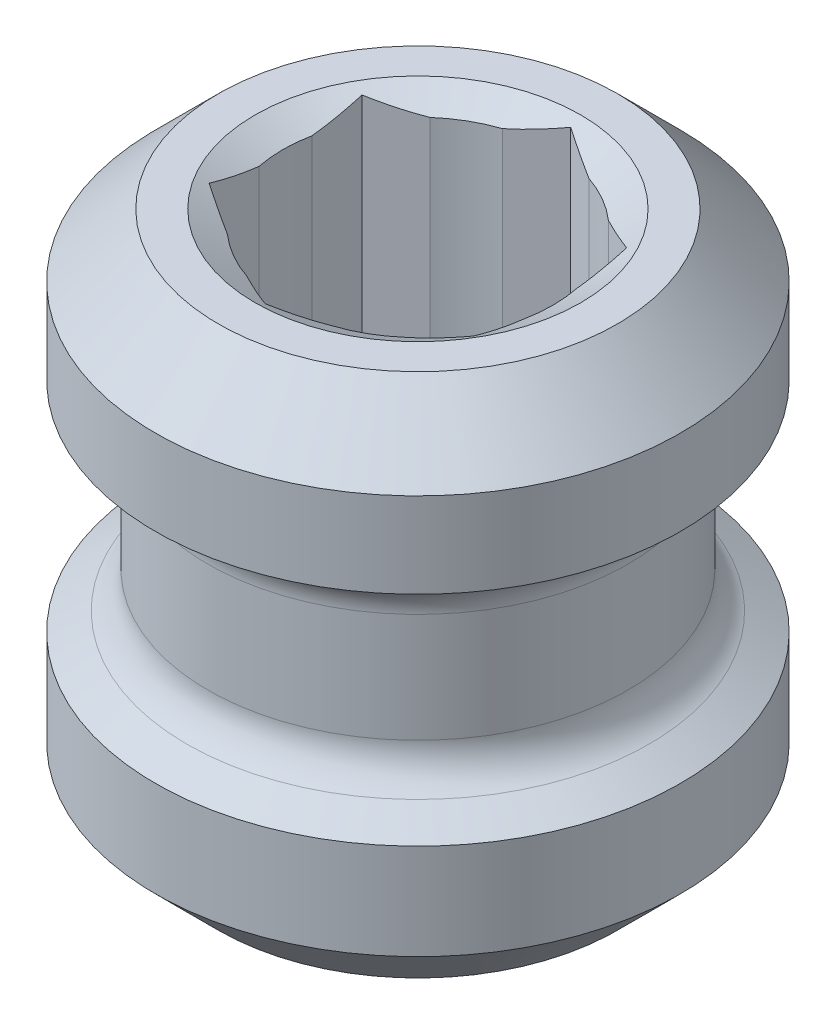
ISO-10303-21;
HEADER;
FILE_DESCRIPTION(('STEP AP214'),'2;1');
FILE_NAME('part.step','',(''),(''),'','','');
FILE_SCHEMA(('AUTOMOTIVE_DESIGN { 1 0 10303 214 1 1 1 1 }'));
ENDSEC;
DATA;
#1=APPLICATION_CONTEXT('core data for automotive mechanical design processes');
#2=APPLICATION_PROTOCOL_DEFINITION('international standard','automotive_design',2000,#1);
#3=PRODUCT_CONTEXT('',#1,'mechanical');
#4=PRODUCT('Part','Part','',(#3));
#5=PRODUCT_RELATED_PRODUCT_CATEGORY('part','',(#4));
#6=PRODUCT_DEFINITION_FORMATION('','',#4);
#7=PRODUCT_DEFINITION_CONTEXT('part definition',#1,'design');
#8=PRODUCT_DEFINITION('design','',#6,#7);
#9=PRODUCT_DEFINITION_SHAPE('','',#8);
#10=(LENGTH_UNIT() NAMED_UNIT(*) SI_UNIT(.MILLI.,.METRE.));
#11=(NAMED_UNIT(*) PLANE_ANGLE_UNIT() SI_UNIT($,.RADIAN.));
#12=(NAMED_UNIT(*) SI_UNIT($,.STERADIAN.) SOLID_ANGLE_UNIT());
#13=UNCERTAINTY_MEASURE_WITH_UNIT(LENGTH_MEASURE(1.E-05),#10,'distance_accuracy_value','');
#14=(GEOMETRIC_REPRESENTATION_CONTEXT(3) GLOBAL_UNCERTAINTY_ASSIGNED_CONTEXT((#13)) GLOBAL_UNIT_ASSIGNED_CONTEXT((#10,
#11,#12)) REPRESENTATION_CONTEXT('',''));
#15=CARTESIAN_POINT('',(0.,0.,0.));
#16=DIRECTION('',(0.,0.,1.));
#17=DIRECTION('',(1.,0.,0.));
#18=AXIS2_PLACEMENT_3D('',#15,#16,#17);
#19=CARTESIAN_POINT('',(-1.9,0.,1.9));
#20=DIRECTION('',(0.,1.,0.));
#21=DIRECTION('',(1.,0.,0.));
#22=AXIS2_PLACEMENT_3D('',#19,#20,#21);
#23=PLANE('',#22);
#24=CARTESIAN_POINT('',(0.,0.,0.));
#25=DIRECTION('',(0.,1.,0.));
#26=DIRECTION('',(0.,0.,-1.));
#27=AXIS2_PLACEMENT_3D('',#24,#25,#26);
#28=CIRCLE('',#27,1.9);
#29=CARTESIAN_POINT('',(0.,0.,-1.9));
#30=VERTEX_POINT('',#29);
#31=EDGE_CURVE('E687',#30,#30,#28,.F.);
#32=ORIENTED_EDGE('',*,*,#31,.F.);
#33=EDGE_LOOP('',(#32));
#34=FACE_BOUND('',#33,.T.);
#35=CARTESIAN_POINT('',(0.,0.,0.));
#36=DIRECTION('',(0.,-1.,0.));
#37=DIRECTION('',(-1.42053891230658E-07,0.,0.99999999999999));
#38=AXIS2_PLACEMENT_3D('',#35,#36,#37);
#39=CIRCLE('',#38,1.55);
#40=CARTESIAN_POINT('',(-2.2018353140752E-07,0.,1.54999999999998));
#41=VERTEX_POINT('',#40);
#42=EDGE_CURVE('E690',#41,#41,#39,.T.);
#43=ORIENTED_EDGE('',*,*,#42,.T.);
#44=EDGE_LOOP('',(#43));
#45=FACE_BOUND('',#44,.T.);
#46=ADVANCED_FACE('F17',(#34,#45),#23,.T.);
#47=CARTESIAN_POINT('',(-1.89999990775909,-5.,-1.9));
#48=DIRECTION('',(0.,-1.,0.));
#49=DIRECTION('',(1.,0.,0.));
#50=AXIS2_PLACEMENT_3D('',#47,#48,#49);
#51=PLANE('',#50);
#52=CARTESIAN_POINT('',(0.,-5.,0.));
#53=DIRECTION('',(0.,-1.,0.));
#54=DIRECTION('',(-1.42331230310484E-07,0.,0.99999999999999));
#55=AXIS2_PLACEMENT_3D('',#52,#53,#54);
#56=CIRCLE('',#55,1.9);
#57=CARTESIAN_POINT('',(-2.70429337589919E-07,-5.,1.89999999999998));
#58=VERTEX_POINT('',#57);
#59=EDGE_CURVE('E162',#58,#58,#56,.T.);
#60=ORIENTED_EDGE('',*,*,#59,.T.);
#61=EDGE_LOOP('',(#60));
#62=FACE_BOUND('',#61,.T.);
#63=ADVANCED_FACE('F677',(#62),#51,.T.);
#64=CARTESIAN_POINT('',(-0.411553782362925,-2.5,1.21731199132464));
#65=DIRECTION('',(0.,1.,0.));
#66=DIRECTION('',(0.,0.,1.));
#67=AXIS2_PLACEMENT_3D('',#64,#65,#66);
#68=PLANE('',#67);
#69=DIRECTION('',(0.866025403784427,0.,0.50000000000002));
#70=VECTOR('',#69,1.);
#71=CARTESIAN_POINT('',(-0.411553782362925,-2.5,1.21731199132464));
#72=LINE('',#71,#70);
#73=CARTESIAN_POINT('',(-0.411553782362925,-2.5,1.21731199132464));
#74=VERTEX_POINT('',#73);
#75=CARTESIAN_POINT('',(0.,-2.5,1.4549226783579));
#76=VERTEX_POINT('',#75);
#77=EDGE_CURVE('E147',#74,#76,#72,.T.);
#78=ORIENTED_EDGE('',*,*,#77,.T.);
#79=DIRECTION('',(0.866025403784427,0.,-0.500000000000021));
#80=VECTOR('',#79,1.);
#81=CARTESIAN_POINT('',(0.,-2.5,1.4549226783579));
#82=LINE('',#81,#80);
#83=CARTESIAN_POINT('',(0.411553782362922,-2.5,1.21731199132464));
#84=VERTEX_POINT('',#83);
#85=EDGE_CURVE('E160',#76,#84,#82,.T.);
#86=ORIENTED_EDGE('',*,*,#85,.T.);
#87=CARTESIAN_POINT('',(0.,-2.5,0.));
#88=DIRECTION('',(0.,-1.,0.));
#89=DIRECTION('',(0.,0.,1.));
#90=AXIS2_PLACEMENT_3D('',#87,#88,#89);
#91=CIRCLE('',#90,1.285);
#92=EDGE_CURVE('E161',#74,#84,#91,.F.);
#93=ORIENTED_EDGE('',*,*,#92,.F.);
#94=EDGE_LOOP('',(#78,#86,#93));
#95=FACE_BOUND('',#94,.T.);
#96=ADVANCED_FACE('F159',(#95),#68,.T.);
#97=CARTESIAN_POINT('',(-3.23030319388712E-10,-2.5,1.4549226785444));
#98=DIRECTION('',(-0.500000000000021,0.,-0.866025403784426));
#99=DIRECTION('',(0.,1.,0.));
#100=AXIS2_PLACEMENT_3D('',#97,#98,#99);
#101=PLANE('',#100);
#102=CARTESIAN_POINT('',(-7.15967421970864E-11,-0.0548929171704897,1.45492267839924));
#103=CARTESIAN_POINT('',(0.135696955066982,-0.100125235606626,1.37657800482176));
#104=CARTESIAN_POINT('',(0.27244949612285,-0.134794104457231,1.29762388843079));
#105=CARTESIAN_POINT('',(0.411553782307821,-0.152997821332945,1.21731199135646));
#106=B_SPLINE_CURVE_WITH_KNOTS('',3,(#102,#103,#104,#105),.UNSPECIFIED.,.F.,.F.,(4,4),(0.,1.),.UNSPECIFIED.);
#107=CARTESIAN_POINT('',(-7.15967421970863E-11,-0.0548929171704895,1.45492267839924));
#108=VERTEX_POINT('',#107);
#109=CARTESIAN_POINT('',(0.411553782307821,-0.152997821332945,1.21731199135646));
#110=VERTEX_POINT('',#109);
#111=EDGE_CURVE('E167',#108,#110,#106,.T.);
#112=ORIENTED_EDGE('',*,*,#111,.T.);
#113=DIRECTION('',(2.3477481819412E-11,-1.,-1.35547367491119E-11));
#114=VECTOR('',#113,1.);
#115=CARTESIAN_POINT('',(0.411553782307821,-0.152997821332945,1.21731199135646));
#116=LINE('',#115,#114);
#117=EDGE_CURVE('E154',#110,#84,#116,.T.);
#118=ORIENTED_EDGE('',*,*,#117,.T.);
#119=ORIENTED_EDGE('',*,*,#85,.F.);
#120=DIRECTION('',(-2.92816486784645E-11,1.,1.69057993725262E-11));
#121=VECTOR('',#120,1.);
#122=CARTESIAN_POINT('',(0.,-2.5,1.4549226783579));
#123=LINE('',#122,#121);
#124=EDGE_CURVE('E143',#76,#108,#123,.T.);
#125=ORIENTED_EDGE('',*,*,#124,.T.);
#126=EDGE_LOOP('',(#112,#118,#119,#125));
#127=FACE_BOUND('',#126,.T.);
#128=ADVANCED_FACE('F165',(#127),#101,.T.);
#129=CARTESIAN_POINT('',(-0.411553782363124,-2.5,1.21731199132453));
#130=DIRECTION('',(0.500000000000021,0.,-0.866025403784426));
#131=DIRECTION('',(0.,1.,0.));
#132=AXIS2_PLACEMENT_3D('',#129,#130,#131);
#133=PLANE('',#132);
#134=CARTESIAN_POINT('',(-0.41155378236312,-0.152997821336553,1.21731199132453));
#135=CARTESIAN_POINT('',(-0.272239159490032,-0.134766579907637,1.29774532634236));
#136=CARTESIAN_POINT('',(-0.135439762622364,-0.10003950473868,1.37672649494889));
#137=CARTESIAN_POINT('',(-4.40698367555614E-11,-0.0548929171704897,1.45492267833246));
#138=B_SPLINE_CURVE_WITH_KNOTS('',3,(#134,#135,#136,#137),.UNSPECIFIED.,.F.,.F.,(4,4),(0.,1.),.UNSPECIFIED.);
#139=CARTESIAN_POINT('',(-0.41155378236312,-0.152997821336553,1.21731199132453));
#140=VERTEX_POINT('',#139);
#141=EDGE_CURVE('E149',#140,#108,#138,.T.);
#142=ORIENTED_EDGE('',*,*,#141,.T.);
#143=ORIENTED_EDGE('',*,*,#124,.F.);
#144=ORIENTED_EDGE('',*,*,#77,.F.);
#145=DIRECTION('',(0.,1.,0.));
#146=VECTOR('',#145,1.);
#147=CARTESIAN_POINT('',(-0.411553782362925,-2.5,1.21731199132464));
#148=LINE('',#147,#146);
#149=EDGE_CURVE('E202',#74,#140,#148,.T.);
#150=ORIENTED_EDGE('',*,*,#149,.T.);
#151=EDGE_LOOP('',(#142,#143,#144,#150));
#152=FACE_BOUND('',#151,.T.);
#153=ADVANCED_FACE('F145',(#152),#133,.T.);
#154=CARTESIAN_POINT('',(-1.26,-2.5,0.252239965112585));
#155=DIRECTION('',(0.,1.,0.));
#156=DIRECTION('',(0.,0.,1.));
#157=AXIS2_PLACEMENT_3D('',#154,#155,#156);
#158=PLANE('',#157);
#159=DIRECTION('',(0.,0.,1.));
#160=VECTOR('',#159,1.);
#161=CARTESIAN_POINT('',(-1.26,-2.5,0.252239965112585));
#162=LINE('',#161,#160);
#163=CARTESIAN_POINT('',(-1.26,-2.5,0.252239965112585));
#164=VERTEX_POINT('',#163);
#165=CARTESIAN_POINT('',(-1.26,-2.5,0.72746133917893));
#166=VERTEX_POINT('',#165);
#167=EDGE_CURVE('E209',#164,#166,#162,.T.);
#168=ORIENTED_EDGE('',*,*,#167,.T.);
#169=DIRECTION('',(0.866025403784427,0.,0.500000000000021));
#170=VECTOR('',#169,1.);
#171=CARTESIAN_POINT('',(-1.26,-2.5,0.72746133917893));
#172=LINE('',#171,#170);
#173=CARTESIAN_POINT('',(-0.848446217637154,-2.5,0.965072026212141));
#174=VERTEX_POINT('',#173);
#175=EDGE_CURVE('E214',#166,#174,#172,.T.);
#176=ORIENTED_EDGE('',*,*,#175,.T.);
#177=CARTESIAN_POINT('',(0.,-2.5,0.));
#178=DIRECTION('',(0.,-1.,0.));
#179=DIRECTION('',(-0.660269430067824,0.,0.751028814172872));
#180=AXIS2_PLACEMENT_3D('',#177,#178,#179);
#181=CIRCLE('',#180,1.285);
#182=EDGE_CURVE('E219',#164,#174,#181,.F.);
#183=ORIENTED_EDGE('',*,*,#182,.F.);
#184=EDGE_LOOP('',(#168,#176,#183));
#185=FACE_BOUND('',#184,.T.);
#186=ADVANCED_FACE('F195',(#185),#158,.T.);
#187=CARTESIAN_POINT('',(-1.26000000018504,-2.5,0.727461339072096));
#188=DIRECTION('',(0.500000000000021,0.,-0.866025403784426));
#189=DIRECTION('',(0.,1.,0.));
#190=AXIS2_PLACEMENT_3D('',#187,#188,#189);
#191=PLANE('',#190);
#192=CARTESIAN_POINT('',(-1.26000000004688,-0.0548929172057787,0.727461339151866));
#193=CARTESIAN_POINT('',(-1.12430368448686,-0.100125199416145,0.805805643468487));
#194=CARTESIAN_POINT('',(-0.987551792711206,-0.134794132867628,0.884759384997355));
#195=CARTESIAN_POINT('',(-0.848448183927942,-0.152998100066561,0.965070890973625));
#196=B_SPLINE_CURVE_WITH_KNOTS('',3,(#192,#193,#194,#195),.UNSPECIFIED.,.F.,.F.,(4,4),(0.,1.),.UNSPECIFIED.);
#197=CARTESIAN_POINT('',(-1.26000000004688,-0.0548929172057786,0.727461339151866));
#198=VERTEX_POINT('',#197);
#199=CARTESIAN_POINT('',(-0.848448183927942,-0.152998100066561,0.965070890973625));
#200=VERTEX_POINT('',#199);
#201=EDGE_CURVE('E223',#198,#200,#196,.T.);
#202=ORIENTED_EDGE('',*,*,#201,.T.);
#203=DIRECTION('',(8.37788324103234E-07,-0.999999999999532,4.83697314434155E-07));
#204=VECTOR('',#203,1.);
#205=CARTESIAN_POINT('',(-0.848448183927942,-0.152998100066561,0.965070890973625));
#206=LINE('',#205,#204);
#207=EDGE_CURVE('E234',#200,#174,#206,.T.);
#208=ORIENTED_EDGE('',*,*,#207,.T.);
#209=ORIENTED_EDGE('',*,*,#175,.F.);
#210=DIRECTION('',(-1.9171463272424E-11,1.,-1.10686431216181E-11));
#211=VECTOR('',#210,1.);
#212=CARTESIAN_POINT('',(-1.26,-2.5,0.72746133917893));
#213=LINE('',#212,#211);
#214=EDGE_CURVE('E937',#166,#198,#213,.T.);
#215=ORIENTED_EDGE('',*,*,#214,.T.);
#216=EDGE_LOOP('',(#202,#208,#209,#215));
#217=FACE_BOUND('',#216,.T.);
#218=ADVANCED_FACE('F236',(#217),#191,.T.);
#219=CARTESIAN_POINT('',(-1.26,-2.5,0.252239965112361));
#220=DIRECTION('',(1.,0.,0.));
#221=DIRECTION('',(0.,1.,0.));
#222=AXIS2_PLACEMENT_3D('',#219,#220,#221);
#223=PLANE('',#222);
#224=CARTESIAN_POINT('',(-1.26,-0.152997821336549,0.252239965112361));
#225=CARTESIAN_POINT('',(-1.26,-0.134766583498668,0.413106603495697));
#226=CARTESIAN_POINT('',(-1.26,-0.100039515931176,0.571068933652496));
#227=CARTESIAN_POINT('',(-1.26,-0.0548929172057787,0.727461339141318));
#228=B_SPLINE_CURVE_WITH_KNOTS('',3,(#224,#225,#226,#227),.UNSPECIFIED.,.F.,.F.,(4,4),(0.,1.),.UNSPECIFIED.);
#229=CARTESIAN_POINT('',(-1.26,-0.15299782133655,0.252239965112361));
#230=VERTEX_POINT('',#229);
#231=EDGE_CURVE('E268',#230,#198,#228,.T.);
#232=ORIENTED_EDGE('',*,*,#231,.T.);
#233=ORIENTED_EDGE('',*,*,#214,.F.);
#234=ORIENTED_EDGE('',*,*,#167,.F.);
#235=DIRECTION('',(0.,1.,0.));
#236=VECTOR('',#235,1.);
#237=CARTESIAN_POINT('',(-1.26,-2.5,0.252239965112585));
#238=LINE('',#237,#236);
#239=EDGE_CURVE('E259',#164,#230,#238,.T.);
#240=ORIENTED_EDGE('',*,*,#239,.T.);
#241=EDGE_LOOP('',(#232,#233,#234,#240));
#242=FACE_BOUND('',#241,.T.);
#243=ADVANCED_FACE('F245',(#242),#223,.T.);
#244=CARTESIAN_POINT('',(-1.26,-2.5,-0.965072026212144));
#245=DIRECTION('',(0.,1.,0.));
#246=DIRECTION('',(0.,0.,1.));
#247=AXIS2_PLACEMENT_3D('',#244,#245,#246);
#248=PLANE('',#247);
#249=DIRECTION('',(-0.866025403784426,0.,0.500000000000022));
#250=VECTOR('',#249,1.);
#251=CARTESIAN_POINT('',(-0.84844621763715,-2.5,-0.965072026212144));
#252=LINE('',#251,#250);
#253=CARTESIAN_POINT('',(-0.84844621763715,-2.5,-0.965072026212144));
#254=VERTEX_POINT('',#253);
#255=CARTESIAN_POINT('',(-1.26,-2.5,-0.72746133917893));
#256=VERTEX_POINT('',#255);
#257=EDGE_CURVE('E267',#254,#256,#252,.T.);
#258=ORIENTED_EDGE('',*,*,#257,.T.);
#259=DIRECTION('',(0.,0.,1.));
#260=VECTOR('',#259,1.);
#261=CARTESIAN_POINT('',(-1.26,-2.5,-0.72746133917893));
#262=LINE('',#261,#260);
#263=CARTESIAN_POINT('',(-1.26,-2.5,-0.252239965112591));
#264=VERTEX_POINT('',#263);
#265=EDGE_CURVE('E273',#256,#264,#262,.T.);
#266=ORIENTED_EDGE('',*,*,#265,.T.);
#267=CARTESIAN_POINT('',(0.,-2.5,0.));
#268=DIRECTION('',(0.,-1.,0.));
#269=DIRECTION('',(-0.980544747081712,0.,-0.196295692694623));
#270=AXIS2_PLACEMENT_3D('',#267,#268,#269);
#271=CIRCLE('',#270,1.285);
#272=EDGE_CURVE('E278',#254,#264,#271,.F.);
#273=ORIENTED_EDGE('',*,*,#272,.F.);
#274=EDGE_LOOP('',(#258,#266,#273));
#275=FACE_BOUND('',#274,.T.);
#276=ADVANCED_FACE('F249',(#275),#248,.T.);
#277=CARTESIAN_POINT('',(-0.848446217636949,-2.5,-0.96507202621226));
#278=DIRECTION('',(0.500000000000021,0.,0.866025403784426));
#279=DIRECTION('',(0.,1.,0.));
#280=AXIS2_PLACEMENT_3D('',#277,#278,#279);
#281=PLANE('',#280);
#282=CARTESIAN_POINT('',(-0.848446217636953,-0.152997821336551,-0.965072026212258));
#283=CARTESIAN_POINT('',(-0.987756949960992,-0.134765650157228,-0.884640937403965));
#284=CARTESIAN_POINT('',(-1.12455259645385,-0.100038588373231,-0.805661934077342));
#285=CARTESIAN_POINT('',(-1.25998865219525,-0.0548924381989111,-0.72746789083706));
#286=B_SPLINE_CURVE_WITH_KNOTS('',3,(#282,#283,#284,#285),.UNSPECIFIED.,.F.,.F.,(4,4),(0.,1.),.UNSPECIFIED.);
#287=CARTESIAN_POINT('',(-0.848446217636953,-0.152997821336551,-0.965072026212258));
#288=VERTEX_POINT('',#287);
#289=CARTESIAN_POINT('',(-1.25998865219525,-0.0548924381989111,-0.72746789083706));
#290=VERTEX_POINT('',#289);
#291=EDGE_CURVE('E282',#288,#290,#286,.T.);
#292=ORIENTED_EDGE('',*,*,#291,.T.);
#293=DIRECTION('',(-4.64102476775778E-06,-0.999999999985641,2.67949689900884E-06));
#294=VECTOR('',#293,1.);
#295=CARTESIAN_POINT('',(-1.25998865219525,-0.0548924381989111,-0.72746789083706));
#296=LINE('',#295,#294);
#297=EDGE_CURVE('E295',#256,#290,#296,.F.);
#298=ORIENTED_EDGE('',*,*,#297,.F.);
#299=ORIENTED_EDGE('',*,*,#257,.F.);
#300=DIRECTION('',(0.,1.,0.));
#301=VECTOR('',#300,1.);
#302=CARTESIAN_POINT('',(-0.84844621763715,-2.5,-0.965072026212144));
#303=LINE('',#302,#301);
#304=EDGE_CURVE('E924',#254,#288,#303,.T.);
#305=ORIENTED_EDGE('',*,*,#304,.T.);
#306=EDGE_LOOP('',(#292,#298,#299,#305));
#307=FACE_BOUND('',#306,.T.);
#308=ADVANCED_FACE('F297',(#307),#281,.T.);
#309=CARTESIAN_POINT('',(-1.26,-2.5,-0.727475272094648));
#310=DIRECTION('',(1.,0.,0.));
#311=DIRECTION('',(0.,1.,0.));
#312=AXIS2_PLACEMENT_3D('',#309,#310,#311);
#313=PLANE('',#312);
#314=CARTESIAN_POINT('',(-1.26,-0.0548924381989111,-0.727471581472396));
#315=CARTESIAN_POINT('',(-1.26,-0.100124401617692,-0.570781265936996));
#316=CARTESIAN_POINT('',(-1.26,-0.134793175860767,-0.412872729526523));
#317=CARTESIAN_POINT('',(-1.26,-0.152997860234912,-0.252249076128134));
#318=B_SPLINE_CURVE_WITH_KNOTS('',3,(#314,#315,#316,#317),.UNSPECIFIED.,.F.,.F.,(4,4),(0.,1.),.UNSPECIFIED.);
#319=CARTESIAN_POINT('',(-1.26,-0.152997860234912,-0.252249076128134));
#320=VERTEX_POINT('',#319);
#321=EDGE_CURVE('E329',#290,#320,#318,.T.);
#322=ORIENTED_EDGE('',*,*,#321,.T.);
#323=DIRECTION('',(0.,-0.999999999992465,3.88198007533528E-06));
#324=VECTOR('',#323,1.);
#325=CARTESIAN_POINT('',(-1.26,-0.152997860234912,-0.252249076128134));
#326=LINE('',#325,#324);
#327=EDGE_CURVE('E320',#320,#264,#326,.T.);
#328=ORIENTED_EDGE('',*,*,#327,.T.);
#329=ORIENTED_EDGE('',*,*,#265,.F.);
#330=ORIENTED_EDGE('',*,*,#297,.T.);
#331=EDGE_LOOP('',(#322,#328,#329,#330));
#332=FACE_BOUND('',#331,.T.);
#333=ADVANCED_FACE('F306',(#332),#313,.T.);
#334=CARTESIAN_POINT('',(-0.411553782362921,-2.5,-1.4549226783579));
#335=DIRECTION('',(0.,1.,0.));
#336=DIRECTION('',(0.,0.,1.));
#337=AXIS2_PLACEMENT_3D('',#334,#335,#336);
#338=PLANE('',#337);
#339=DIRECTION('',(-0.866025403784426,0.,-0.500000000000021));
#340=VECTOR('',#339,1.);
#341=CARTESIAN_POINT('',(0.411553782362922,-2.5,-1.21731199132464));
#342=LINE('',#341,#340);
#343=CARTESIAN_POINT('',(0.411553782362922,-2.5,-1.21731199132464));
#344=VERTEX_POINT('',#343);
#345=CARTESIAN_POINT('',(0.,-2.5,-1.4549226783579));
#346=VERTEX_POINT('',#345);
#347=EDGE_CURVE('E328',#344,#346,#342,.T.);
#348=ORIENTED_EDGE('',*,*,#347,.T.);
#349=DIRECTION('',(-0.866025403784426,0.,0.500000000000021));
#350=VECTOR('',#349,1.);
#351=CARTESIAN_POINT('',(0.,-2.5,-1.4549226783579));
#352=LINE('',#351,#350);
#353=CARTESIAN_POINT('',(-0.411553782362921,-2.5,-1.21731199132465));
#354=VERTEX_POINT('',#353);
#355=EDGE_CURVE('E334',#346,#354,#352,.T.);
#356=ORIENTED_EDGE('',*,*,#355,.T.);
#357=CARTESIAN_POINT('',(0.,-2.5,0.));
#358=DIRECTION('',(0.,-1.,0.));
#359=DIRECTION('',(0.,0.,-1.));
#360=AXIS2_PLACEMENT_3D('',#357,#358,#359);
#361=CIRCLE('',#360,1.285);
#362=EDGE_CURVE('E339',#344,#354,#361,.F.);
#363=ORIENTED_EDGE('',*,*,#362,.F.);
#364=EDGE_LOOP('',(#348,#356,#363));
#365=FACE_BOUND('',#364,.T.);
#366=ADVANCED_FACE('F310',(#365),#338,.T.);
#367=CARTESIAN_POINT('',(1.85042653722784E-10,-2.5,-1.45492267846473));
#368=DIRECTION('',(0.500000000000021,0.,0.866025403784426));
#369=DIRECTION('',(0.,1.,0.));
#370=AXIS2_PLACEMENT_3D('',#367,#368,#369);
#371=PLANE('',#370);
#372=CARTESIAN_POINT('',(4.32235029562113E-11,-0.0548929172033193,-1.45492267838285));
#373=CARTESIAN_POINT('',(-0.135696457319773,-0.100125069688222,-1.37657829219625));
#374=CARTESIAN_POINT('',(-0.272448493099114,-0.1347938501814,-1.29762446752681));
#375=CARTESIAN_POINT('',(-0.411552252137528,-0.152997621089255,-1.21731287480069));
#376=B_SPLINE_CURVE_WITH_KNOTS('',3,(#372,#373,#374,#375),.UNSPECIFIED.,.F.,.F.,(4,4),(0.,1.),.UNSPECIFIED.);
#377=CARTESIAN_POINT('',(4.32235029562113E-11,-0.0548929172033192,-1.45492267838285));
#378=VERTEX_POINT('',#377);
#379=CARTESIAN_POINT('',(-0.411552252137528,-0.152997621089255,-1.21731287480069));
#380=VERTEX_POINT('',#379);
#381=EDGE_CURVE('E343',#378,#380,#376,.T.);
#382=ORIENTED_EDGE('',*,*,#381,.T.);
#383=DIRECTION('',(-6.51991411036232E-07,-0.999999999999717,3.76427416632413E-07));
#384=VECTOR('',#383,1.);
#385=CARTESIAN_POINT('',(-0.411552252137528,-0.152997621089255,-1.21731287480069));
#386=LINE('',#385,#384);
#387=EDGE_CURVE('E354',#380,#354,#386,.T.);
#388=ORIENTED_EDGE('',*,*,#387,.T.);
#389=ORIENTED_EDGE('',*,*,#355,.F.);
#390=DIRECTION('',(1.76775311093677E-11,1.,-1.02060671245393E-11));
#391=VECTOR('',#390,1.);
#392=CARTESIAN_POINT('',(0.,-2.5,-1.4549226783579));
#393=LINE('',#392,#391);
#394=EDGE_CURVE('E665',#346,#378,#393,.T.);
#395=ORIENTED_EDGE('',*,*,#394,.T.);
#396=EDGE_LOOP('',(#382,#388,#389,#395));
#397=FACE_BOUND('',#396,.T.);
#398=ADVANCED_FACE('F356',(#397),#371,.T.);
#399=CARTESIAN_POINT('',(0.411553782363122,-2.5,-1.21731199132453));
#400=DIRECTION('',(-0.500000000000021,0.,0.866025403784426));
#401=DIRECTION('',(0.,1.,0.));
#402=AXIS2_PLACEMENT_3D('',#399,#400,#401);
#403=PLANE('',#402);
#404=CARTESIAN_POINT('',(0.411553782363118,-0.152997821336552,-1.21731199132453));
#405=CARTESIAN_POINT('',(0.27223915941338,-0.134766579901344,-1.29774532638662));
#406=CARTESIAN_POINT('',(0.135439762524516,-0.100039504725335,-1.37672649500539));
#407=CARTESIAN_POINT('',(2.8007761040949E-11,-0.0548929172033198,-1.45492267834173));
#408=B_SPLINE_CURVE_WITH_KNOTS('',3,(#404,#405,#406,#407),.UNSPECIFIED.,.F.,.F.,(4,4),(0.,1.),.UNSPECIFIED.);
#409=CARTESIAN_POINT('',(0.411553782363118,-0.152997821336552,-1.21731199132453));
#410=VERTEX_POINT('',#409);
#411=EDGE_CURVE('E388',#410,#378,#408,.T.);
#412=ORIENTED_EDGE('',*,*,#411,.T.);
#413=ORIENTED_EDGE('',*,*,#394,.F.);
#414=ORIENTED_EDGE('',*,*,#347,.F.);
#415=DIRECTION('',(0.,1.,0.));
#416=VECTOR('',#415,1.);
#417=CARTESIAN_POINT('',(0.411553782362922,-2.5,-1.21731199132464));
#418=LINE('',#417,#416);
#419=EDGE_CURVE('E379',#344,#410,#418,.T.);
#420=ORIENTED_EDGE('',*,*,#419,.T.);
#421=EDGE_LOOP('',(#412,#413,#414,#420));
#422=FACE_BOUND('',#421,.T.);
#423=ADVANCED_FACE('F365',(#422),#403,.T.);
#424=CARTESIAN_POINT('',(0.848446217637152,-2.5,-0.965072026212143));
#425=DIRECTION('',(0.,1.,0.));
#426=DIRECTION('',(0.,0.,1.));
#427=AXIS2_PLACEMENT_3D('',#424,#425,#426);
#428=PLANE('',#427);
#429=DIRECTION('',(0.,0.,-1.));
#430=VECTOR('',#429,1.);
#431=CARTESIAN_POINT('',(1.26,-2.5,-0.252239965112589));
#432=LINE('',#431,#430);
#433=CARTESIAN_POINT('',(1.26,-2.5,-0.252239965112589));
#434=VERTEX_POINT('',#433);
#435=CARTESIAN_POINT('',(1.26,-2.5,-0.72746133917893));
#436=VERTEX_POINT('',#435);
#437=EDGE_CURVE('E387',#434,#436,#432,.T.);
#438=ORIENTED_EDGE('',*,*,#437,.T.);
#439=DIRECTION('',(-0.866025403784426,0.,-0.500000000000021));
#440=VECTOR('',#439,1.);
#441=CARTESIAN_POINT('',(1.26,-2.5,-0.72746133917893));
#442=LINE('',#441,#440);
#443=CARTESIAN_POINT('',(0.848446217637152,-2.5,-0.965072026212143));
#444=VERTEX_POINT('',#443);
#445=EDGE_CURVE('E393',#436,#444,#442,.T.);
#446=ORIENTED_EDGE('',*,*,#445,.T.);
#447=CARTESIAN_POINT('',(0.,-2.5,0.));
#448=DIRECTION('',(0.,-1.,0.));
#449=DIRECTION('',(0.660269430067823,0.,-0.751028814172874));
#450=AXIS2_PLACEMENT_3D('',#447,#448,#449);
#451=CIRCLE('',#450,1.285);
#452=EDGE_CURVE('E398',#434,#444,#451,.F.);
#453=ORIENTED_EDGE('',*,*,#452,.F.);
#454=EDGE_LOOP('',(#438,#446,#453));
#455=FACE_BOUND('',#454,.T.);
#456=ADVANCED_FACE('F369',(#455),#428,.T.);
#457=CARTESIAN_POINT('',(1.26000000018504,-2.5,-0.727461339072096));
#458=DIRECTION('',(-0.500000000000021,0.,0.866025403784426));
#459=DIRECTION('',(0.,1.,0.));
#460=AXIS2_PLACEMENT_3D('',#457,#458,#459);
#461=PLANE('',#460);
#462=CARTESIAN_POINT('',(1.26000000004688,-0.0548929172057787,-0.727461339151866));
#463=CARTESIAN_POINT('',(1.12430304512117,-0.10012523554734,-0.805806012606442));
#464=CARTESIAN_POINT('',(0.987550504038235,-0.134794104427851,-0.884760129013042));
#465=CARTESIAN_POINT('',(0.848446217696407,-0.152997821332033,-0.965072026177932));
#466=B_SPLINE_CURVE_WITH_KNOTS('',3,(#462,#463,#464,#465),.UNSPECIFIED.,.F.,.F.,(4,4),(0.,1.),.UNSPECIFIED.);
#467=CARTESIAN_POINT('',(1.26000000004688,-0.0548929172057786,-0.727461339151866));
#468=VERTEX_POINT('',#467);
#469=CARTESIAN_POINT('',(0.848446217696407,-0.152997821332034,-0.965072026177932));
#470=VERTEX_POINT('',#469);
#471=EDGE_CURVE('E402',#468,#470,#466,.T.);
#472=ORIENTED_EDGE('',*,*,#471,.T.);
#473=DIRECTION('',(-2.5247214467067E-11,-1.,-1.45764531892033E-11));
#474=VECTOR('',#473,1.);
#475=CARTESIAN_POINT('',(0.848446217696407,-0.152997821332034,-0.965072026177932));
#476=LINE('',#475,#474);
#477=EDGE_CURVE('E413',#470,#444,#476,.T.);
#478=ORIENTED_EDGE('',*,*,#477,.T.);
#479=ORIENTED_EDGE('',*,*,#445,.F.);
#480=DIRECTION('',(1.9171463272424E-11,1.,1.10686431216181E-11));
#481=VECTOR('',#480,1.);
#482=CARTESIAN_POINT('',(1.26,-2.5,-0.72746133917893));
#483=LINE('',#482,#481);
#484=EDGE_CURVE('E621',#436,#468,#483,.T.);
#485=ORIENTED_EDGE('',*,*,#484,.T.);
#486=EDGE_LOOP('',(#472,#478,#479,#485));
#487=FACE_BOUND('',#486,.T.);
#488=ADVANCED_FACE('F415',(#487),#461,.T.);
#489=CARTESIAN_POINT('',(1.26,-2.5,-0.252239965112362));
#490=DIRECTION('',(-1.,0.,0.));
#491=DIRECTION('',(0.,1.,0.));
#492=AXIS2_PLACEMENT_3D('',#489,#490,#491);
#493=PLANE('',#492);
#494=CARTESIAN_POINT('',(1.26,-0.152997821336549,-0.252239965112362));
#495=CARTESIAN_POINT('',(1.26,-0.134766583498657,-0.413106603495738));
#496=CARTESIAN_POINT('',(1.26,-0.100039515931189,-0.571068933652455));
#497=CARTESIAN_POINT('',(1.26,-0.0548929172057787,-0.727461339141318));
#498=B_SPLINE_CURVE_WITH_KNOTS('',3,(#494,#495,#496,#497),.UNSPECIFIED.,.F.,.F.,(4,4),(0.,1.),.UNSPECIFIED.);
#499=CARTESIAN_POINT('',(1.26,-0.152997821336549,-0.252239965112362));
#500=VERTEX_POINT('',#499);
#501=EDGE_CURVE('E448',#500,#468,#498,.T.);
#502=ORIENTED_EDGE('',*,*,#501,.T.);
#503=ORIENTED_EDGE('',*,*,#484,.F.);
#504=ORIENTED_EDGE('',*,*,#437,.F.);
#505=DIRECTION('',(0.,1.,0.));
#506=VECTOR('',#505,1.);
#507=CARTESIAN_POINT('',(1.26,-2.5,-0.252239965112589));
#508=LINE('',#507,#506);
#509=EDGE_CURVE('E439',#434,#500,#508,.T.);
#510=ORIENTED_EDGE('',*,*,#509,.T.);
#511=EDGE_LOOP('',(#502,#503,#504,#510));
#512=FACE_BOUND('',#511,.T.);
#513=ADVANCED_FACE('F424',(#512),#493,.T.);
#514=CARTESIAN_POINT('',(1.26,-2.5,0.7274613393394));
#515=DIRECTION('',(-1.,0.,0.));
#516=DIRECTION('',(0.,1.,0.));
#517=AXIS2_PLACEMENT_3D('',#514,#515,#516);
#518=PLANE('',#517);
#519=CARTESIAN_POINT('',(1.26,-0.0548929172110219,0.727461339212216));
#520=CARTESIAN_POINT('',(1.26,-0.100125392973213,0.570771446965702));
#521=CARTESIAN_POINT('',(1.26,-0.134794155018108,0.412863313084325));
#522=CARTESIAN_POINT('',(1.26,-0.152997821332037,0.252239965180922));
#523=B_SPLINE_CURVE_WITH_KNOTS('',3,(#519,#520,#521,#522),.UNSPECIFIED.,.F.,.F.,(4,4),(0.,1.),.UNSPECIFIED.);
#524=CARTESIAN_POINT('',(1.26,-0.054892917211022,0.727461339212216));
#525=VERTEX_POINT('',#524);
#526=CARTESIAN_POINT('',(1.26,-0.152997821332037,0.252239965180922));
#527=VERTEX_POINT('',#526);
#528=EDGE_CURVE('E447',#525,#527,#523,.T.);
#529=ORIENTED_EDGE('',*,*,#528,.T.);
#530=DIRECTION('',(0.,-1.,-2.91148031054544E-11));
#531=VECTOR('',#530,1.);
#532=CARTESIAN_POINT('',(1.26,-0.152997821332037,0.252239965180922));
#533=LINE('',#532,#531);
#534=CARTESIAN_POINT('',(1.26,-2.5,0.252239965112589));
#535=VERTEX_POINT('',#534);
#536=EDGE_CURVE('E459',#527,#535,#533,.T.);
#537=ORIENTED_EDGE('',*,*,#536,.T.);
#538=DIRECTION('',(0.,0.,1.));
#539=VECTOR('',#538,1.);
#540=CARTESIAN_POINT('',(1.26,-2.5,0.252239965112589));
#541=LINE('',#540,#539);
#542=CARTESIAN_POINT('',(1.26,-2.5,0.72746133917893));
#543=VERTEX_POINT('',#542);
#544=EDGE_CURVE('E466',#543,#535,#541,.F.);
#545=ORIENTED_EDGE('',*,*,#544,.F.);
#546=DIRECTION('',(0.,1.,1.36131900962073E-11));
#547=VECTOR('',#546,1.);
#548=CARTESIAN_POINT('',(1.26,-2.5,0.72746133917893));
#549=LINE('',#548,#547);
#550=EDGE_CURVE('E471',#543,#525,#549,.T.);
#551=ORIENTED_EDGE('',*,*,#550,.T.);
#552=EDGE_LOOP('',(#529,#537,#545,#551));
#553=FACE_BOUND('',#552,.T.);
#554=ADVANCED_FACE('F428',(#553),#518,.T.);
#555=CARTESIAN_POINT('',(0.848446217637151,-2.5,0.252239965112589));
#556=DIRECTION('',(0.,1.,0.));
#557=DIRECTION('',(0.,0.,1.));
#558=AXIS2_PLACEMENT_3D('',#555,#556,#557);
#559=PLANE('',#558);
#560=DIRECTION('',(0.866025403784427,0.,-0.500000000000021));
#561=VECTOR('',#560,1.);
#562=CARTESIAN_POINT('',(0.848446217637151,-2.5,0.965072026212143));
#563=LINE('',#562,#561);
#564=CARTESIAN_POINT('',(0.848446217637151,-2.5,0.965072026212143));
#565=VERTEX_POINT('',#564);
#566=EDGE_CURVE('E475',#565,#543,#563,.T.);
#567=ORIENTED_EDGE('',*,*,#566,.T.);
#568=ORIENTED_EDGE('',*,*,#544,.T.);
#569=CARTESIAN_POINT('',(0.,-2.5,0.));
#570=DIRECTION('',(0.,-1.,0.));
#571=DIRECTION('',(0.980544747081712,0.,0.196295692694622));
#572=AXIS2_PLACEMENT_3D('',#569,#570,#571);
#573=CIRCLE('',#572,1.285);
#574=EDGE_CURVE('E480',#565,#535,#573,.F.);
#575=ORIENTED_EDGE('',*,*,#574,.F.);
#576=EDGE_LOOP('',(#567,#568,#575));
#577=FACE_BOUND('',#576,.T.);
#578=ADVANCED_FACE('F507',(#577),#559,.T.);
#579=CARTESIAN_POINT('',(0.84844621763695,-2.5,0.965072026212259));
#580=DIRECTION('',(-0.500000000000021,0.,-0.866025403784426));
#581=DIRECTION('',(0.,1.,0.));
#582=AXIS2_PLACEMENT_3D('',#579,#580,#581);
#583=PLANE('',#582);
#584=CARTESIAN_POINT('',(0.848446217636954,-0.152997821336552,0.965072026212257));
#585=CARTESIAN_POINT('',(0.987760840590552,-0.134766579903947,0.884638691147942));
#586=CARTESIAN_POINT('',(1.12456023748325,-0.100039504730493,0.805657522526962));
#587=CARTESIAN_POINT('',(1.25999999998351,-0.0548929172110219,0.727461339188451));
#588=B_SPLINE_CURVE_WITH_KNOTS('',3,(#584,#585,#586,#587),.UNSPECIFIED.,.F.,.F.,(4,4),(0.,1.),.UNSPECIFIED.);
#589=CARTESIAN_POINT('',(0.848446217636954,-0.152997821336553,0.965072026212257));
#590=VERTEX_POINT('',#589);
#591=EDGE_CURVE('E484',#590,#525,#588,.T.);
#592=ORIENTED_EDGE('',*,*,#591,.T.);
#593=ORIENTED_EDGE('',*,*,#550,.F.);
#594=ORIENTED_EDGE('',*,*,#566,.F.);
#595=DIRECTION('',(0.,1.,0.));
#596=VECTOR('',#595,1.);
#597=CARTESIAN_POINT('',(0.848446217637151,-2.5,0.965072026212143));
#598=LINE('',#597,#596);
#599=EDGE_CURVE('E495',#565,#590,#598,.T.);
#600=ORIENTED_EDGE('',*,*,#599,.T.);
#601=EDGE_LOOP('',(#592,#593,#594,#600));
#602=FACE_BOUND('',#601,.T.);
#603=ADVANCED_FACE('F497',(#602),#583,.T.);
#604=CARTESIAN_POINT('',(0.,-0.6,0.));
#605=DIRECTION('',(0.,-1.,0.));
#606=DIRECTION('',(0.,0.,1.));
#607=AXIS2_PLACEMENT_3D('',#604,#605,#606);
#608=CONICAL_SURFACE('',#607,2.5,0.785398163397449);
#609=CARTESIAN_POINT('',(0.,-0.6,0.));
#610=DIRECTION('',(0.,1.,0.));
#611=DIRECTION('',(0.,0.,-1.));
#612=AXIS2_PLACEMENT_3D('',#609,#610,#611);
#613=CIRCLE('',#612,2.5);
#614=CARTESIAN_POINT('',(0.,-0.6,-2.5));
#615=VERTEX_POINT('',#614);
#616=EDGE_CURVE('E635',#615,#615,#613,.F.);
#617=ORIENTED_EDGE('',*,*,#616,.F.);
#618=EDGE_LOOP('',(#617));
#619=FACE_BOUND('',#618,.T.);
#620=ORIENTED_EDGE('',*,*,#31,.T.);
#621=EDGE_LOOP('',(#620));
#622=FACE_BOUND('',#621,.T.);
#623=ADVANCED_FACE('F506',(#619,#622),#608,.T.);
#624=CARTESIAN_POINT('',(0.,-5.,0.));
#625=DIRECTION('',(0.,-1.,0.));
#626=DIRECTION('',(1.92326721555755E-10,0.,1.));
#627=AXIS2_PLACEMENT_3D('',#624,#625,#626);
#628=CYLINDRICAL_SURFACE('',#627,2.5);
#629=CARTESIAN_POINT('',(0.,-1.4113248654052,0.));
#630=DIRECTION('',(0.,1.,0.));
#631=DIRECTION('',(0.,0.,-1.));
#632=AXIS2_PLACEMENT_3D('',#629,#630,#631);
#633=CIRCLE('',#632,2.5);
#634=CARTESIAN_POINT('',(0.,-1.4113248654052,-2.5));
#635=VERTEX_POINT('',#634);
#636=EDGE_CURVE('E638',#635,#635,#633,.F.);
#637=ORIENTED_EDGE('',*,*,#636,.F.);
#638=EDGE_LOOP('',(#637));
#639=FACE_BOUND('',#638,.T.);
#640=ORIENTED_EDGE('',*,*,#616,.T.);
#641=EDGE_LOOP('',(#640));
#642=FACE_BOUND('',#641,.T.);
#643=ADVANCED_FACE('F510',(#639,#642),#628,.T.);
#644=CARTESIAN_POINT('',(0.,-1.4113248654052,0.));
#645=DIRECTION('',(0.,1.,0.));
#646=DIRECTION('',(0.,0.,-1.));
#647=AXIS2_PLACEMENT_3D('',#644,#645,#646);
#648=CONICAL_SURFACE('',#647,2.5,1.04719755119657);
#649=CARTESIAN_POINT('',(0.,-1.5845299461621,0.));
#650=DIRECTION('',(0.,1.,0.));
#651=DIRECTION('',(0.,0.,-1.));
#652=AXIS2_PLACEMENT_3D('',#649,#650,#651);
#653=CIRCLE('',#652,2.2);
#654=CARTESIAN_POINT('',(0.,-1.5845299461621,-2.2));
#655=VERTEX_POINT('',#654);
#656=EDGE_CURVE('E643',#655,#655,#653,.F.);
#657=ORIENTED_EDGE('',*,*,#656,.F.);
#658=EDGE_LOOP('',(#657));
#659=FACE_BOUND('',#658,.T.);
#660=ORIENTED_EDGE('',*,*,#636,.T.);
#661=EDGE_LOOP('',(#660));
#662=FACE_BOUND('',#661,.T.);
#663=ADVANCED_FACE('F514',(#659,#662),#648,.T.);
#664=CARTESIAN_POINT('',(0.,-1.93094010767585,0.));
#665=DIRECTION('',(0.,-1.,0.));
#666=DIRECTION('',(1.92333382893903E-10,0.,1.));
#667=AXIS2_PLACEMENT_3D('',#664,#665,#666);
#668=TOROIDAL_SURFACE('',#667,2.39999999999995,0.399999999999943);
#669=CARTESIAN_POINT('',(0.,-1.9309401076759,0.));
#670=DIRECTION('',(0.,1.,0.));
#671=DIRECTION('',(0.,0.,-1.));
#672=AXIS2_PLACEMENT_3D('',#669,#670,#671);
#673=CIRCLE('',#672,2.);
#674=CARTESIAN_POINT('',(0.,-1.9309401076759,-2.));
#675=VERTEX_POINT('',#674);
#676=EDGE_CURVE('E649',#675,#675,#673,.F.);
#677=ORIENTED_EDGE('',*,*,#676,.F.);
#678=EDGE_LOOP('',(#677));
#679=FACE_BOUND('',#678,.T.);
#680=ORIENTED_EDGE('',*,*,#656,.T.);
#681=EDGE_LOOP('',(#680));
#682=FACE_BOUND('',#681,.T.);
#683=ADVANCED_FACE('F518',(#679,#682),#668,.F.);
#684=CARTESIAN_POINT('',(0.,-5.,0.));
#685=DIRECTION('',(0.,-1.,0.));
#686=DIRECTION('',(1.92328497912594E-10,0.,1.));
#687=AXIS2_PLACEMENT_3D('',#684,#685,#686);
#688=CYLINDRICAL_SURFACE('',#687,2.);
#689=CARTESIAN_POINT('',(0.,-2.9690598923241,0.));
#690=DIRECTION('',(0.,1.,0.));
#691=DIRECTION('',(0.,0.,-1.));
#692=AXIS2_PLACEMENT_3D('',#689,#690,#691);
#693=CIRCLE('',#692,2.);
#694=CARTESIAN_POINT('',(0.,-2.9690598923241,-2.));
#695=VERTEX_POINT('',#694);
#696=EDGE_CURVE('E652',#695,#695,#693,.F.);
#697=ORIENTED_EDGE('',*,*,#696,.F.);
#698=EDGE_LOOP('',(#697));
#699=FACE_BOUND('',#698,.T.);
#700=ORIENTED_EDGE('',*,*,#676,.T.);
#701=EDGE_LOOP('',(#700));
#702=FACE_BOUND('',#701,.T.);
#703=ADVANCED_FACE('F522',(#699,#702),#688,.T.);
#704=CARTESIAN_POINT('',(0.,-2.96905989232416,0.));
#705=DIRECTION('',(0.,-1.,0.));
#706=DIRECTION('',(7.69313624256337E-10,0.,1.));
#707=AXIS2_PLACEMENT_3D('',#704,#705,#706);
#708=TOROIDAL_SURFACE('',#707,2.39999999999995,0.399999999999945);
#709=CARTESIAN_POINT('',(0.,-3.3154700538379,0.));
#710=DIRECTION('',(0.,1.,0.));
#711=DIRECTION('',(0.,0.,-1.));
#712=AXIS2_PLACEMENT_3D('',#709,#710,#711);
#713=CIRCLE('',#712,2.2);
#714=CARTESIAN_POINT('',(0.,-3.3154700538379,-2.2));
#715=VERTEX_POINT('',#714);
#716=EDGE_CURVE('E655',#715,#715,#713,.F.);
#717=ORIENTED_EDGE('',*,*,#716,.F.);
#718=EDGE_LOOP('',(#717));
#719=FACE_BOUND('',#718,.T.);
#720=ORIENTED_EDGE('',*,*,#696,.T.);
#721=EDGE_LOOP('',(#720));
#722=FACE_BOUND('',#721,.T.);
#723=ADVANCED_FACE('F526',(#719,#722),#708,.F.);
#724=CARTESIAN_POINT('',(0.,-3.4886751345948,0.));
#725=DIRECTION('',(0.,-1.,0.));
#726=DIRECTION('',(7.69333164181571E-10,0.,1.));
#727=AXIS2_PLACEMENT_3D('',#724,#725,#726);
#728=CONICAL_SURFACE('',#727,2.5,1.04719755119657);
#729=CARTESIAN_POINT('',(0.,-3.4886751345948,0.));
#730=DIRECTION('',(0.,1.,0.));
#731=DIRECTION('',(0.,0.,-1.));
#732=AXIS2_PLACEMENT_3D('',#729,#730,#731);
#733=CIRCLE('',#732,2.5);
#734=CARTESIAN_POINT('',(0.,-3.4886751345948,-2.5));
#735=VERTEX_POINT('',#734);
#736=EDGE_CURVE('E658',#735,#735,#733,.F.);
#737=ORIENTED_EDGE('',*,*,#736,.F.);
#738=EDGE_LOOP('',(#737));
#739=FACE_BOUND('',#738,.T.);
#740=ORIENTED_EDGE('',*,*,#716,.T.);
#741=EDGE_LOOP('',(#740));
#742=FACE_BOUND('',#741,.T.);
#743=ADVANCED_FACE('F530',(#739,#742),#728,.T.);
#744=CARTESIAN_POINT('',(0.,-5.,0.));
#745=DIRECTION('',(0.,-1.,0.));
#746=DIRECTION('',(0.,0.,1.));
#747=AXIS2_PLACEMENT_3D('',#744,#745,#746);
#748=CYLINDRICAL_SURFACE('',#747,2.5);
#749=CARTESIAN_POINT('',(0.,-4.4,0.));
#750=DIRECTION('',(0.,1.,0.));
#751=DIRECTION('',(0.,0.,-1.));
#752=AXIS2_PLACEMENT_3D('',#749,#750,#751);
#753=CIRCLE('',#752,2.5);
#754=CARTESIAN_POINT('',(0.,-4.4,-2.5));
#755=VERTEX_POINT('',#754);
#756=EDGE_CURVE('E631',#755,#755,#753,.F.);
#757=ORIENTED_EDGE('',*,*,#756,.F.);
#758=EDGE_LOOP('',(#757));
#759=FACE_BOUND('',#758,.T.);
#760=ORIENTED_EDGE('',*,*,#736,.T.);
#761=EDGE_LOOP('',(#760));
#762=FACE_BOUND('',#761,.T.);
#763=ADVANCED_FACE('F534',(#759,#762),#748,.T.);
#764=CARTESIAN_POINT('',(0.,-4.4,0.));
#765=DIRECTION('',(0.,1.,0.));
#766=DIRECTION('',(0.,0.,-1.));
#767=AXIS2_PLACEMENT_3D('',#764,#765,#766);
#768=CONICAL_SURFACE('',#767,2.5,0.785398163397449);
#769=ORIENTED_EDGE('',*,*,#59,.F.);
#770=EDGE_LOOP('',(#769));
#771=FACE_BOUND('',#770,.T.);
#772=ORIENTED_EDGE('',*,*,#756,.T.);
#773=EDGE_LOOP('',(#772));
#774=FACE_BOUND('',#773,.T.);
#775=ADVANCED_FACE('F538',(#771,#774),#768,.T.);
#776=CARTESIAN_POINT('',(0.,0.,0.));
#777=DIRECTION('',(0.,1.,0.));
#778=DIRECTION('',(2.54255405958556E-10,0.,-1.));
#779=AXIS2_PLACEMENT_3D('',#776,#777,#778);
#780=CONICAL_SURFACE('',#779,1.55,1.0471975511966);
#781=ORIENTED_EDGE('',*,*,#381,.F.);
#782=ORIENTED_EDGE('',*,*,#411,.F.);
#783=CARTESIAN_POINT('',(0.,-0.152997821335586,0.));
#784=DIRECTION('',(0.,-1.,0.));
#785=DIRECTION('',(0.320275317014114,0.,-0.947324506867372));
#786=AXIS2_PLACEMENT_3D('',#783,#784,#785);
#787=CIRCLE('',#786,1.28499999999942);
#788=EDGE_CURVE('E629',#410,#470,#787,.T.);
#789=ORIENTED_EDGE('',*,*,#788,.T.);
#790=ORIENTED_EDGE('',*,*,#471,.F.);
#791=ORIENTED_EDGE('',*,*,#501,.F.);
#792=CARTESIAN_POINT('',(0.,-0.152997821335585,0.));
#793=DIRECTION('',(0.,-1.,0.));
#794=DIRECTION('',(0.980544747081747,0.,-0.196295692694449));
#795=AXIS2_PLACEMENT_3D('',#792,#793,#794);
#796=CIRCLE('',#795,1.28499999999942);
#797=EDGE_CURVE('E619',#500,#527,#796,.T.);
#798=ORIENTED_EDGE('',*,*,#797,.T.);
#799=ORIENTED_EDGE('',*,*,#528,.F.);
#800=ORIENTED_EDGE('',*,*,#591,.F.);
#801=CARTESIAN_POINT('',(0.,-0.152997821335586,0.));
#802=DIRECTION('',(0.,-1.,0.));
#803=DIRECTION('',(0.660269430067689,0.,0.751028814172991));
#804=AXIS2_PLACEMENT_3D('',#801,#802,#803);
#805=CIRCLE('',#804,1.28499999999942);
#806=EDGE_CURVE('E35',#590,#110,#805,.T.);
#807=ORIENTED_EDGE('',*,*,#806,.T.);
#808=ORIENTED_EDGE('',*,*,#111,.F.);
#809=ORIENTED_EDGE('',*,*,#141,.F.);
#810=CARTESIAN_POINT('',(0.,-0.152997821335586,0.));
#811=DIRECTION('',(0.,-1.,0.));
#812=DIRECTION('',(-0.320275317014116,0.,0.947324506867371));
#813=AXIS2_PLACEMENT_3D('',#810,#811,#812);
#814=CIRCLE('',#813,1.28499999999942);
#815=EDGE_CURVE('E630',#140,#200,#814,.T.);
#816=ORIENTED_EDGE('',*,*,#815,.T.);
#817=ORIENTED_EDGE('',*,*,#201,.F.);
#818=ORIENTED_EDGE('',*,*,#231,.F.);
#819=CARTESIAN_POINT('',(0.,-0.152997821335585,0.));
#820=DIRECTION('',(0.,-1.,0.));
#821=DIRECTION('',(-0.980544747081747,0.,0.196295692694447));
#822=AXIS2_PLACEMENT_3D('',#819,#820,#821);
#823=CIRCLE('',#822,1.28499999999942);
#824=EDGE_CURVE('E930',#230,#320,#823,.T.);
#825=ORIENTED_EDGE('',*,*,#824,.T.);
#826=ORIENTED_EDGE('',*,*,#321,.F.);
#827=ORIENTED_EDGE('',*,*,#291,.F.);
#828=CARTESIAN_POINT('',(0.,-0.152997821335586,0.));
#829=DIRECTION('',(0.,-1.,0.));
#830=DIRECTION('',(-0.660269430067688,0.,-0.751028814172992));
#831=AXIS2_PLACEMENT_3D('',#828,#829,#830);
#832=CIRCLE('',#831,1.28499999999942);
#833=EDGE_CURVE('E25',#288,#380,#832,.T.);
#834=ORIENTED_EDGE('',*,*,#833,.T.);
#835=EDGE_LOOP('',(#781,#782,#789,#790,#791,#798,#799,#800,#807,#808,#809,#816,#817,#818,#825,
#826,#827,#834));
#836=FACE_BOUND('',#835,.T.);
#837=ORIENTED_EDGE('',*,*,#42,.F.);
#838=EDGE_LOOP('',(#837));
#839=FACE_BOUND('',#838,.T.);
#840=ADVANCED_FACE('F542',(#836,#839),#780,.F.);
#841=CARTESIAN_POINT('',(0.,-4.2,0.));
#842=DIRECTION('',(0.,-1.,0.));
#843=DIRECTION('',(0.,0.,1.));
#844=AXIS2_PLACEMENT_3D('',#841,#842,#843);
#845=CYLINDRICAL_SURFACE('',#844,1.285);
#846=CARTESIAN_POINT('',(0.,-3.4581049040913,0.));
#847=DIRECTION('',(0.,-1.,0.));
#848=DIRECTION('',(0.,0.,1.));
#849=AXIS2_PLACEMENT_3D('',#846,#847,#848);
#850=CIRCLE('',#849,1.285);
#851=CARTESIAN_POINT('',(0.,-3.4581049040913,1.285));
#852=VERTEX_POINT('',#851);
#853=EDGE_CURVE('E11',#852,#852,#850,.T.);
#854=ORIENTED_EDGE('',*,*,#853,.T.);
#855=EDGE_LOOP('',(#854));
#856=FACE_BOUND('',#855,.T.);
#857=ORIENTED_EDGE('',*,*,#387,.F.);
#858=ORIENTED_EDGE('',*,*,#833,.F.);
#859=ORIENTED_EDGE('',*,*,#304,.F.);
#860=ORIENTED_EDGE('',*,*,#272,.T.);
#861=ORIENTED_EDGE('',*,*,#327,.F.);
#862=ORIENTED_EDGE('',*,*,#824,.F.);
#863=ORIENTED_EDGE('',*,*,#239,.F.);
#864=ORIENTED_EDGE('',*,*,#182,.T.);
#865=ORIENTED_EDGE('',*,*,#207,.F.);
#866=ORIENTED_EDGE('',*,*,#815,.F.);
#867=ORIENTED_EDGE('',*,*,#149,.F.);
#868=ORIENTED_EDGE('',*,*,#92,.T.);
#869=ORIENTED_EDGE('',*,*,#117,.F.);
#870=ORIENTED_EDGE('',*,*,#806,.F.);
#871=ORIENTED_EDGE('',*,*,#599,.F.);
#872=ORIENTED_EDGE('',*,*,#574,.T.);
#873=ORIENTED_EDGE('',*,*,#536,.F.);
#874=ORIENTED_EDGE('',*,*,#797,.F.);
#875=ORIENTED_EDGE('',*,*,#509,.F.);
#876=ORIENTED_EDGE('',*,*,#452,.T.);
#877=ORIENTED_EDGE('',*,*,#477,.F.);
#878=ORIENTED_EDGE('',*,*,#788,.F.);
#879=ORIENTED_EDGE('',*,*,#419,.F.);
#880=ORIENTED_EDGE('',*,*,#362,.T.);
#881=EDGE_LOOP('',(#857,#858,#859,#860,#861,#862,#863,#864,#865,#866,#867,#868,#869,#870,#871,
#872,#873,#874,#875,#876,#877,#878,#879,#880));
#882=FACE_BOUND('',#881,.T.);
#883=ADVANCED_FACE('F546',(#856,#882),#845,.F.);
#884=CARTESIAN_POINT('',(0.,-3.4581049040913,0.));
#885=DIRECTION('',(0.,1.,0.));
#886=DIRECTION('',(0.,0.,-1.));
#887=AXIS2_PLACEMENT_3D('',#884,#885,#886);
#888=CONICAL_SURFACE('',#887,1.285,1.04719755119658);
#889=ORIENTED_EDGE('',*,*,#853,.F.);
#890=EDGE_LOOP('',(#889));
#891=FACE_BOUND('',#890,.T.);
#892=CARTESIAN_POINT('',(0.,-4.2,0.));
#893=VERTEX_POINT('',#892);
#894=VERTEX_LOOP('',#893);
#895=FACE_BOUND('',#894,.T.);
#896=ADVANCED_FACE('F19',(#891,#895),#888,.F.);
#897=CLOSED_SHELL('',(#46,#63,#96,#128,#153,#186,#218,#243,#276,#308,#333,#366,#398,#423,#456,
#488,#513,#554,#578,#603,#623,#643,#663,#683,#703,#723,#743,#763,#775,#840,#883,#896));
#898=MANIFOLD_SOLID_BREP('B1',#897);
#899=ADVANCED_BREP_SHAPE_REPRESENTATION('',(#18,#898),#14);
#900=SHAPE_DEFINITION_REPRESENTATION(#9,#899);
ENDSEC;
END-ISO-10303-21;
